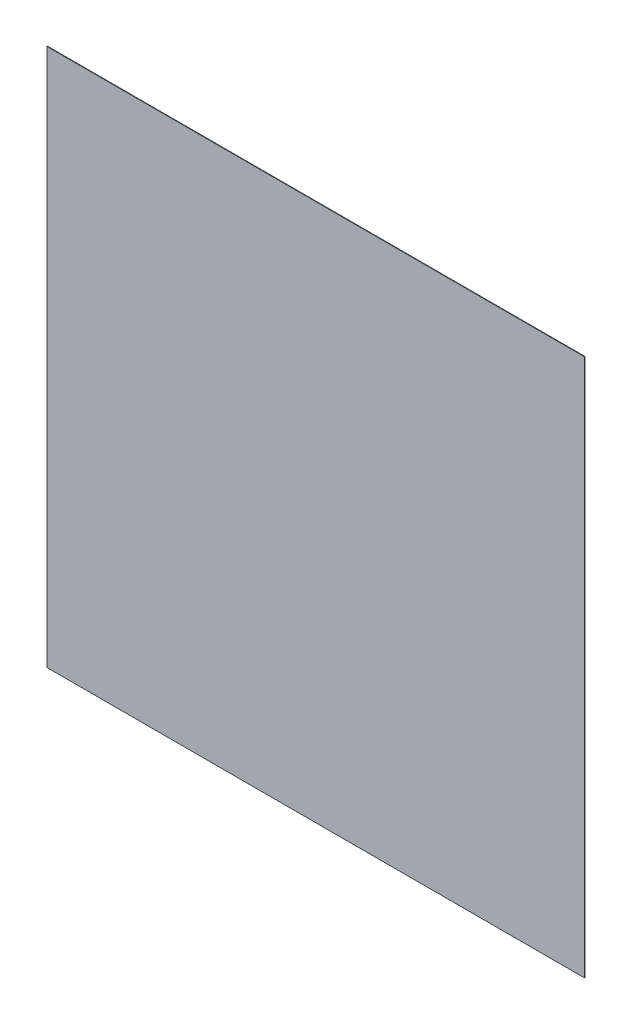
ISO-10303-21;
HEADER;
FILE_DESCRIPTION(('STEP AP214'),'2;1');
FILE_NAME('part.step','',(''),(''),'','','');
FILE_SCHEMA(('AUTOMOTIVE_DESIGN { 1 0 10303 214 1 1 1 1 }'));
ENDSEC;
DATA;
#1=APPLICATION_CONTEXT('core data for automotive mechanical design processes');
#2=APPLICATION_PROTOCOL_DEFINITION('international standard','automotive_design',2000,#1);
#3=PRODUCT_CONTEXT('',#1,'mechanical');
#4=PRODUCT('Part','Part','',(#3));
#5=PRODUCT_RELATED_PRODUCT_CATEGORY('part','',(#4));
#6=PRODUCT_DEFINITION_FORMATION('','',#4);
#7=PRODUCT_DEFINITION_CONTEXT('part definition',#1,'design');
#8=PRODUCT_DEFINITION('design','',#6,#7);
#9=PRODUCT_DEFINITION_SHAPE('','',#8);
#10=(LENGTH_UNIT() NAMED_UNIT(*) SI_UNIT(.MILLI.,.METRE.));
#11=(NAMED_UNIT(*) PLANE_ANGLE_UNIT() SI_UNIT($,.RADIAN.));
#12=(NAMED_UNIT(*) SI_UNIT($,.STERADIAN.) SOLID_ANGLE_UNIT());
#13=UNCERTAINTY_MEASURE_WITH_UNIT(LENGTH_MEASURE(1.E-05),#10,'distance_accuracy_value','');
#14=(GEOMETRIC_REPRESENTATION_CONTEXT(3) GLOBAL_UNCERTAINTY_ASSIGNED_CONTEXT((#13)) GLOBAL_UNIT_ASSIGNED_CONTEXT((#10,
#11,#12)) REPRESENTATION_CONTEXT('',''));
#15=CARTESIAN_POINT('',(0.,0.,0.));
#16=DIRECTION('',(0.,0.,1.));
#17=DIRECTION('',(1.,0.,0.));
#18=AXIS2_PLACEMENT_3D('',#15,#16,#17);
#19=CARTESIAN_POINT('',(0.,0.,10.));
#20=DIRECTION('',(1.,0.,0.));
#21=DIRECTION('',(0.,0.,-1.));
#22=AXIS2_PLACEMENT_3D('',#19,#20,#21);
#23=PLANE('',#22);
#24=DIRECTION('',(0.,-1.,0.));
#25=VECTOR('',#24,1.);
#26=CARTESIAN_POINT('',(0.,0.,0.));
#27=LINE('',#26,#25);
#28=CARTESIAN_POINT('',(0.,10000.,0.));
#29=VERTEX_POINT('',#28);
#30=CARTESIAN_POINT('',(0.,0.,0.));
#31=VERTEX_POINT('',#30);
#32=EDGE_CURVE('E98',#29,#31,#27,.T.);
#33=ORIENTED_EDGE('',*,*,#32,.T.);
#34=DIRECTION('',(0.,0.,-1.));
#35=VECTOR('',#34,1.);
#36=CARTESIAN_POINT('',(0.,0.,10.));
#37=LINE('',#36,#35);
#38=CARTESIAN_POINT('',(0.,0.,10.));
#39=VERTEX_POINT('',#38);
#40=EDGE_CURVE('E11',#39,#31,#37,.T.);
#41=ORIENTED_EDGE('',*,*,#40,.F.);
#42=DIRECTION('',(0.,-1.,0.));
#43=VECTOR('',#42,1.);
#44=CARTESIAN_POINT('',(0.,0.,10.));
#45=LINE('',#44,#43);
#46=CARTESIAN_POINT('',(0.,10000.,10.));
#47=VERTEX_POINT('',#46);
#48=EDGE_CURVE('E86',#47,#39,#45,.T.);
#49=ORIENTED_EDGE('',*,*,#48,.F.);
#50=DIRECTION('',(0.,0.,-1.));
#51=VECTOR('',#50,1.);
#52=CARTESIAN_POINT('',(0.,10000.,10.));
#53=LINE('',#52,#51);
#54=EDGE_CURVE('E94',#47,#29,#53,.T.);
#55=ORIENTED_EDGE('',*,*,#54,.T.);
#56=EDGE_LOOP('',(#33,#41,#49,#55));
#57=FACE_BOUND('',#56,.T.);
#58=ADVANCED_FACE('F35',(#57),#23,.F.);
#59=CARTESIAN_POINT('',(0.,0.,10.));
#60=DIRECTION('',(0.,1.,0.));
#61=DIRECTION('',(0.,0.,1.));
#62=AXIS2_PLACEMENT_3D('',#59,#60,#61);
#63=PLANE('',#62);
#64=DIRECTION('',(1.,0.,0.));
#65=VECTOR('',#64,1.);
#66=CARTESIAN_POINT('',(0.,0.,0.));
#67=LINE('',#66,#65);
#68=CARTESIAN_POINT('',(10000.,0.,0.));
#69=VERTEX_POINT('',#68);
#70=EDGE_CURVE('E90',#31,#69,#67,.T.);
#71=ORIENTED_EDGE('',*,*,#70,.T.);
#72=DIRECTION('',(0.,0.,-1.));
#73=VECTOR('',#72,1.);
#74=CARTESIAN_POINT('',(10000.,0.,10.));
#75=LINE('',#74,#73);
#76=CARTESIAN_POINT('',(10000.,0.,10.));
#77=VERTEX_POINT('',#76);
#78=EDGE_CURVE('E43',#77,#69,#75,.T.);
#79=ORIENTED_EDGE('',*,*,#78,.F.);
#80=DIRECTION('',(1.,0.,0.));
#81=VECTOR('',#80,1.);
#82=CARTESIAN_POINT('',(0.,0.,10.));
#83=LINE('',#82,#81);
#84=EDGE_CURVE('E81',#39,#77,#83,.T.);
#85=ORIENTED_EDGE('',*,*,#84,.F.);
#86=ORIENTED_EDGE('',*,*,#40,.T.);
#87=EDGE_LOOP('',(#71,#79,#85,#86));
#88=FACE_BOUND('',#87,.T.);
#89=ADVANCED_FACE('F89',(#88),#63,.F.);
#90=CARTESIAN_POINT('',(10000.,0.,10.));
#91=DIRECTION('',(-1.,0.,0.));
#92=DIRECTION('',(0.,0.,1.));
#93=AXIS2_PLACEMENT_3D('',#90,#91,#92);
#94=PLANE('',#93);
#95=DIRECTION('',(0.,1.,0.));
#96=VECTOR('',#95,1.);
#97=CARTESIAN_POINT('',(10000.,0.,0.));
#98=LINE('',#97,#96);
#99=CARTESIAN_POINT('',(10000.,10000.,0.));
#100=VERTEX_POINT('',#99);
#101=EDGE_CURVE('E68',#69,#100,#98,.T.);
#102=ORIENTED_EDGE('',*,*,#101,.T.);
#103=DIRECTION('',(0.,0.,-1.));
#104=VECTOR('',#103,1.);
#105=CARTESIAN_POINT('',(10000.,10000.,10.));
#106=LINE('',#105,#104);
#107=CARTESIAN_POINT('',(10000.,10000.,10.));
#108=VERTEX_POINT('',#107);
#109=EDGE_CURVE('E91',#108,#100,#106,.T.);
#110=ORIENTED_EDGE('',*,*,#109,.F.);
#111=DIRECTION('',(0.,1.,0.));
#112=VECTOR('',#111,1.);
#113=CARTESIAN_POINT('',(10000.,0.,10.));
#114=LINE('',#113,#112);
#115=EDGE_CURVE('E84',#77,#108,#114,.T.);
#116=ORIENTED_EDGE('',*,*,#115,.F.);
#117=ORIENTED_EDGE('',*,*,#78,.T.);
#118=EDGE_LOOP('',(#102,#110,#116,#117));
#119=FACE_BOUND('',#118,.T.);
#120=ADVANCED_FACE('F92',(#119),#94,.F.);
#121=CARTESIAN_POINT('',(0.,10000.,10.));
#122=DIRECTION('',(0.,-1.,0.));
#123=DIRECTION('',(0.,0.,-1.));
#124=AXIS2_PLACEMENT_3D('',#121,#122,#123);
#125=PLANE('',#124);
#126=DIRECTION('',(-1.,0.,0.));
#127=VECTOR('',#126,1.);
#128=CARTESIAN_POINT('',(0.,10000.,0.));
#129=LINE('',#128,#127);
#130=EDGE_CURVE('E74',#100,#29,#129,.T.);
#131=ORIENTED_EDGE('',*,*,#130,.T.);
#132=ORIENTED_EDGE('',*,*,#54,.F.);
#133=DIRECTION('',(-1.,0.,0.));
#134=VECTOR('',#133,1.);
#135=CARTESIAN_POINT('',(0.,10000.,10.));
#136=LINE('',#135,#134);
#137=EDGE_CURVE('E51',#108,#47,#136,.T.);
#138=ORIENTED_EDGE('',*,*,#137,.F.);
#139=ORIENTED_EDGE('',*,*,#109,.T.);
#140=EDGE_LOOP('',(#131,#132,#138,#139));
#141=FACE_BOUND('',#140,.T.);
#142=ADVANCED_FACE('F105',(#141),#125,.F.);
#143=CARTESIAN_POINT('',(0.,0.,10.));
#144=DIRECTION('',(0.,0.,-1.));
#145=DIRECTION('',(-1.,0.,0.));
#146=AXIS2_PLACEMENT_3D('',#143,#144,#145);
#147=PLANE('',#146);
#148=ORIENTED_EDGE('',*,*,#48,.T.);
#149=ORIENTED_EDGE('',*,*,#84,.T.);
#150=ORIENTED_EDGE('',*,*,#115,.T.);
#151=ORIENTED_EDGE('',*,*,#137,.T.);
#152=EDGE_LOOP('',(#148,#149,#150,#151));
#153=FACE_BOUND('',#152,.T.);
#154=ADVANCED_FACE('F82',(#153),#147,.F.);
#155=CARTESIAN_POINT('',(0.,0.,0.));
#156=DIRECTION('',(0.,0.,-1.));
#157=DIRECTION('',(-1.,0.,0.));
#158=AXIS2_PLACEMENT_3D('',#155,#156,#157);
#159=PLANE('',#158);
#160=ORIENTED_EDGE('',*,*,#32,.F.);
#161=ORIENTED_EDGE('',*,*,#130,.F.);
#162=ORIENTED_EDGE('',*,*,#101,.F.);
#163=ORIENTED_EDGE('',*,*,#70,.F.);
#164=EDGE_LOOP('',(#160,#161,#162,#163));
#165=FACE_BOUND('',#164,.T.);
#166=ADVANCED_FACE('F108',(#165),#159,.T.);
#167=CLOSED_SHELL('',(#58,#89,#120,#142,#154,#166));
#168=MANIFOLD_SOLID_BREP('B2',#167);
#169=ADVANCED_BREP_SHAPE_REPRESENTATION('',(#18,#168),#14);
#170=SHAPE_DEFINITION_REPRESENTATION(#9,#169);
ENDSEC;
END-ISO-10303-21;
